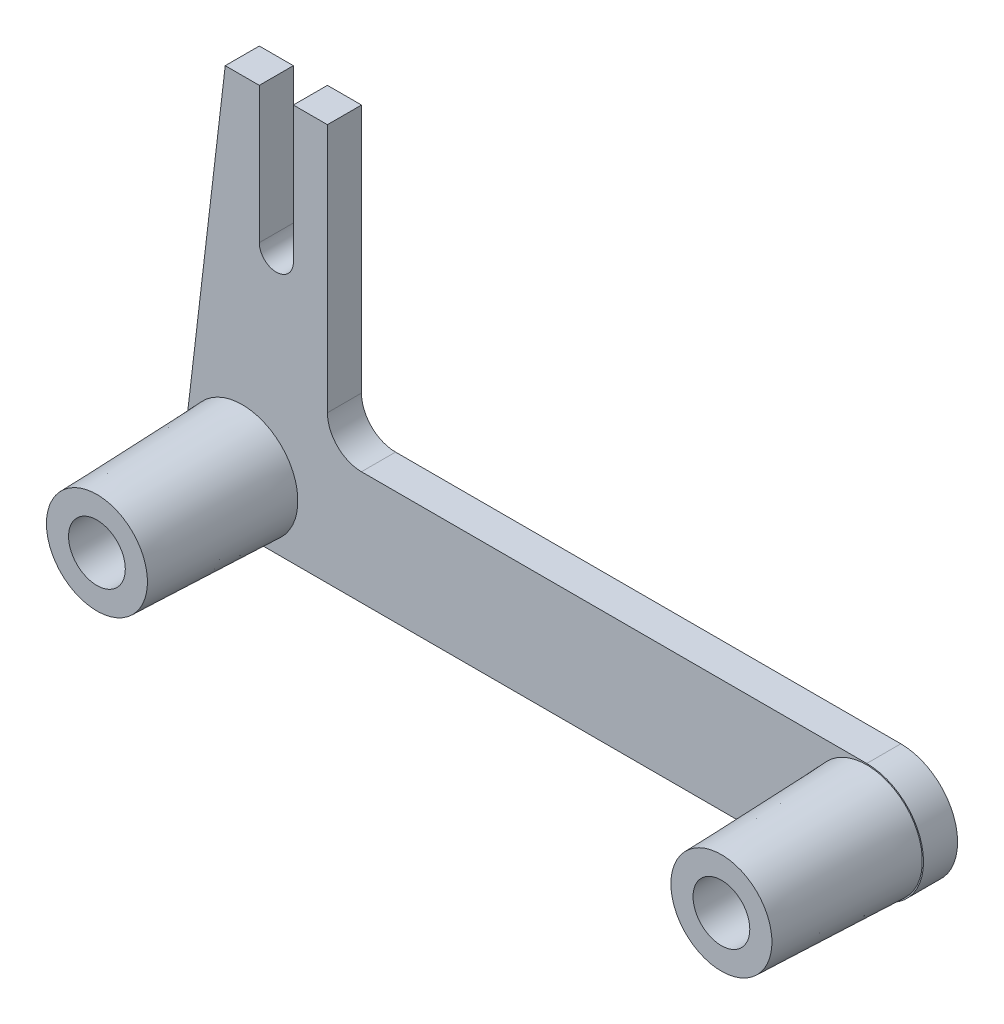
ISO-10303-21;
HEADER;
FILE_DESCRIPTION(('STEP AP214'),'2;1');
FILE_NAME('part.step','',(''),(''),'','','');
FILE_SCHEMA(('AUTOMOTIVE_DESIGN { 1 0 10303 214 1 1 1 1 }'));
ENDSEC;
DATA;
#1=APPLICATION_CONTEXT('core data for automotive mechanical design processes');
#2=APPLICATION_PROTOCOL_DEFINITION('international standard','automotive_design',2000,#1);
#3=PRODUCT_CONTEXT('',#1,'mechanical');
#4=PRODUCT('Part','Part','',(#3));
#5=PRODUCT_RELATED_PRODUCT_CATEGORY('part','',(#4));
#6=PRODUCT_DEFINITION_FORMATION('','',#4);
#7=PRODUCT_DEFINITION_CONTEXT('part definition',#1,'design');
#8=PRODUCT_DEFINITION('design','',#6,#7);
#9=PRODUCT_DEFINITION_SHAPE('','',#8);
#10=(LENGTH_UNIT() NAMED_UNIT(*) SI_UNIT(.MILLI.,.METRE.));
#11=(NAMED_UNIT(*) PLANE_ANGLE_UNIT() SI_UNIT($,.RADIAN.));
#12=(NAMED_UNIT(*) SI_UNIT($,.STERADIAN.) SOLID_ANGLE_UNIT());
#13=UNCERTAINTY_MEASURE_WITH_UNIT(LENGTH_MEASURE(1.E-05),#10,'distance_accuracy_value','');
#14=(GEOMETRIC_REPRESENTATION_CONTEXT(3) GLOBAL_UNCERTAINTY_ASSIGNED_CONTEXT((#13)) GLOBAL_UNIT_ASSIGNED_CONTEXT((#10,
#11,#12)) REPRESENTATION_CONTEXT('',''));
#15=CARTESIAN_POINT('',(0.,0.,0.));
#16=DIRECTION('',(0.,0.,1.));
#17=DIRECTION('',(1.,0.,0.));
#18=AXIS2_PLACEMENT_3D('',#15,#16,#17);
#19=CARTESIAN_POINT('',(0.149951438834714,1.85557583058385,15.8));
#20=DIRECTION('',(0.,0.,-1.));
#21=DIRECTION('',(-1.,0.,0.));
#22=AXIS2_PLACEMENT_3D('',#19,#20,#21);
#23=PLANE('',#22);
#24=CARTESIAN_POINT('',(0.149951438834714,1.85557583058385,15.8));
#25=DIRECTION('',(0.,0.,-1.));
#26=DIRECTION('',(-1.,0.,0.));
#27=AXIS2_PLACEMENT_3D('',#24,#25,#26);
#28=CIRCLE('',#27,4.44825184203038);
#29=CARTESIAN_POINT('',(-4.29830040319567,1.85557583058385,15.8));
#30=VERTEX_POINT('',#29);
#31=EDGE_CURVE('E141',#30,#30,#28,.T.);
#32=ORIENTED_EDGE('',*,*,#31,.F.);
#33=EDGE_LOOP('',(#32));
#34=FACE_BOUND('',#33,.T.);
#35=CARTESIAN_POINT('',(0.149951438834714,1.85557583058385,15.8));
#36=DIRECTION('',(0.,0.,1.));
#37=DIRECTION('',(1.,0.,0.));
#38=AXIS2_PLACEMENT_3D('',#35,#36,#37);
#39=CIRCLE('',#38,2.5);
#40=CARTESIAN_POINT('',(2.64995143883471,1.85557583058385,15.8));
#41=VERTEX_POINT('',#40);
#42=EDGE_CURVE('E308',#41,#41,#39,.T.);
#43=ORIENTED_EDGE('',*,*,#42,.F.);
#44=EDGE_LOOP('',(#43));
#45=FACE_BOUND('',#44,.T.);
#46=ADVANCED_FACE('F30',(#34,#45),#23,.F.);
#47=CARTESIAN_POINT('',(10.6499514388347,9.88362192636454,0.));
#48=DIRECTION('',(0.,0.,-1.));
#49=DIRECTION('',(-1.,0.,0.));
#50=AXIS2_PLACEMENT_3D('',#47,#48,#49);
#51=PLANE('',#50);
#52=CARTESIAN_POINT('',(55.1499514388347,1.88362192636452,0.));
#53=DIRECTION('',(0.,0.,1.));
#54=DIRECTION('',(1.,0.,0.));
#55=AXIS2_PLACEMENT_3D('',#52,#53,#54);
#56=CIRCLE('',#55,2.5);
#57=CARTESIAN_POINT('',(57.6499514388347,1.88362192636452,0.));
#58=VERTEX_POINT('',#57);
#59=EDGE_CURVE('E299',#58,#58,#56,.T.);
#60=ORIENTED_EDGE('',*,*,#59,.T.);
#61=EDGE_LOOP('',(#60));
#62=FACE_BOUND('',#61,.T.);
#63=DIRECTION('',(-1.,0.,0.));
#64=VECTOR('',#63,1.);
#65=CARTESIAN_POINT('',(55.1499514388347,6.88362192636452,0.));
#66=LINE('',#65,#64);
#67=CARTESIAN_POINT('',(55.1499514388347,6.88362192636452,0.));
#68=VERTEX_POINT('',#67);
#69=CARTESIAN_POINT('',(10.6499514388347,6.88362192636454,0.));
#70=VERTEX_POINT('',#69);
#71=EDGE_CURVE('E164',#68,#70,#66,.T.);
#72=ORIENTED_EDGE('',*,*,#71,.F.);
#73=CARTESIAN_POINT('',(55.1499514388347,1.88362192636452,0.));
#74=DIRECTION('',(0.,0.,1.));
#75=DIRECTION('',(1.,0.,0.));
#76=AXIS2_PLACEMENT_3D('',#73,#74,#75);
#77=CIRCLE('',#76,5.);
#78=CARTESIAN_POINT('',(55.1499514388347,-3.11637807363548,0.));
#79=VERTEX_POINT('',#78);
#80=EDGE_CURVE('E162',#79,#68,#77,.T.);
#81=ORIENTED_EDGE('',*,*,#80,.F.);
#82=DIRECTION('',(1.,0.,0.));
#83=VECTOR('',#82,1.);
#84=CARTESIAN_POINT('',(0.678793924191456,-3.11637807363546,0.));
#85=LINE('',#84,#83);
#86=CARTESIAN_POINT('',(0.678793924191456,-3.11637807363546,0.));
#87=VERTEX_POINT('',#86);
#88=EDGE_CURVE('E160',#87,#79,#85,.T.);
#89=ORIENTED_EDGE('',*,*,#88,.F.);
#90=CARTESIAN_POINT('',(0.149951438834714,1.85557583058385,0.));
#91=DIRECTION('',(0.,0.,1.));
#92=DIRECTION('',(1.,0.,0.));
#93=AXIS2_PLACEMENT_3D('',#90,#91,#92);
#94=CIRCLE('',#93,5.);
#95=CARTESIAN_POINT('',(-4.81570216702394,2.44062648362425,0.));
#96=VERTEX_POINT('',#95);
#97=EDGE_CURVE('E158',#96,#87,#94,.T.);
#98=ORIENTED_EDGE('',*,*,#97,.F.);
#99=DIRECTION('',(-0.11701013060808,-0.99313072117173,0.));
#100=VECTOR('',#99,1.);
#101=CARTESIAN_POINT('',(-1.35004856116529,31.8555758305839,0.));
#102=LINE('',#101,#100);
#103=CARTESIAN_POINT('',(-1.35004856116529,31.8555758305839,0.));
#104=VERTEX_POINT('',#103);
#105=EDGE_CURVE('E156',#104,#96,#102,.T.);
#106=ORIENTED_EDGE('',*,*,#105,.F.);
#107=DIRECTION('',(-1.,0.,0.));
#108=VECTOR('',#107,1.);
#109=CARTESIAN_POINT('',(1.64995143883472,31.8555758305838,0.));
#110=LINE('',#109,#108);
#111=CARTESIAN_POINT('',(1.64995143883472,31.8555758305838,0.));
#112=VERTEX_POINT('',#111);
#113=EDGE_CURVE('E154',#112,#104,#110,.T.);
#114=ORIENTED_EDGE('',*,*,#113,.F.);
#115=DIRECTION('',(0.,1.,0.));
#116=VECTOR('',#115,1.);
#117=CARTESIAN_POINT('',(1.64995143883472,19.8555758305839,0.));
#118=LINE('',#117,#116);
#119=CARTESIAN_POINT('',(1.64995143883472,19.8555758305839,0.));
#120=VERTEX_POINT('',#119);
#121=EDGE_CURVE('E152',#120,#112,#118,.T.);
#122=ORIENTED_EDGE('',*,*,#121,.F.);
#123=CARTESIAN_POINT('',(3.14995143883472,19.8555758305839,0.));
#124=DIRECTION('',(0.,0.,1.));
#125=DIRECTION('',(1.,0.,0.));
#126=AXIS2_PLACEMENT_3D('',#123,#124,#125);
#127=CIRCLE('',#126,1.5);
#128=CARTESIAN_POINT('',(4.64995143883472,19.8555758305839,0.));
#129=VERTEX_POINT('',#128);
#130=EDGE_CURVE('E149',#120,#129,#127,.T.);
#131=ORIENTED_EDGE('',*,*,#130,.T.);
#132=DIRECTION('',(0.,-1.,0.));
#133=VECTOR('',#132,1.);
#134=CARTESIAN_POINT('',(4.64995143883472,31.8555758305839,0.));
#135=LINE('',#134,#133);
#136=CARTESIAN_POINT('',(4.64995143883472,31.8555758305839,0.));
#137=VERTEX_POINT('',#136);
#138=EDGE_CURVE('E146',#137,#129,#135,.T.);
#139=ORIENTED_EDGE('',*,*,#138,.F.);
#140=DIRECTION('',(-1.,0.,0.));
#141=VECTOR('',#140,1.);
#142=CARTESIAN_POINT('',(7.64995143883471,31.8555758305839,0.));
#143=LINE('',#142,#141);
#144=CARTESIAN_POINT('',(7.64995143883471,31.8555758305839,0.));
#145=VERTEX_POINT('',#144);
#146=EDGE_CURVE('E126',#145,#137,#143,.T.);
#147=ORIENTED_EDGE('',*,*,#146,.F.);
#148=DIRECTION('',(0.,1.,0.));
#149=VECTOR('',#148,1.);
#150=CARTESIAN_POINT('',(7.64995143883471,9.88362192636454,0.));
#151=LINE('',#150,#149);
#152=CARTESIAN_POINT('',(7.64995143883471,9.88362192636454,0.));
#153=VERTEX_POINT('',#152);
#154=EDGE_CURVE('E119',#153,#145,#151,.T.);
#155=ORIENTED_EDGE('',*,*,#154,.F.);
#156=CARTESIAN_POINT('',(10.6499514388347,9.88362192636454,0.));
#157=DIRECTION('',(0.,0.,-1.));
#158=DIRECTION('',(-1.,0.,0.));
#159=AXIS2_PLACEMENT_3D('',#156,#157,#158);
#160=CIRCLE('',#159,3.);
#161=EDGE_CURVE('E124',#70,#153,#160,.T.);
#162=ORIENTED_EDGE('',*,*,#161,.F.);
#163=EDGE_LOOP('',(#72,#81,#89,#98,#106,#114,#122,#131,#139,#147,#155,#162));
#164=FACE_BOUND('',#163,.T.);
#165=CARTESIAN_POINT('',(0.149951438834714,1.85557583058385,0.));
#166=DIRECTION('',(0.,0.,1.));
#167=DIRECTION('',(1.,0.,0.));
#168=AXIS2_PLACEMENT_3D('',#165,#166,#167);
#169=CIRCLE('',#168,2.5);
#170=CARTESIAN_POINT('',(2.64995143883472,1.85557583058385,0.));
#171=VERTEX_POINT('',#170);
#172=EDGE_CURVE('E305',#171,#171,#169,.T.);
#173=ORIENTED_EDGE('',*,*,#172,.T.);
#174=EDGE_LOOP('',(#173));
#175=FACE_BOUND('',#174,.T.);
#176=ADVANCED_FACE('F121',(#62,#164,#175),#51,.T.);
#177=CARTESIAN_POINT('',(55.1499514388347,1.88362192636452,15.8));
#178=DIRECTION('',(0.,0.,-1.));
#179=DIRECTION('',(-1.,0.,0.));
#180=AXIS2_PLACEMENT_3D('',#177,#178,#179);
#181=PLANE('',#180);
#182=CARTESIAN_POINT('',(55.1499514388347,1.88362192636452,15.8));
#183=DIRECTION('',(0.,0.,-1.));
#184=DIRECTION('',(-1.,0.,0.));
#185=AXIS2_PLACEMENT_3D('',#182,#183,#184);
#186=CIRCLE('',#185,4.44825184203038);
#187=CARTESIAN_POINT('',(50.7016995968043,1.88362192636452,15.8));
#188=VERTEX_POINT('',#187);
#189=EDGE_CURVE('E294',#188,#188,#186,.T.);
#190=ORIENTED_EDGE('',*,*,#189,.F.);
#191=EDGE_LOOP('',(#190));
#192=FACE_BOUND('',#191,.T.);
#193=CARTESIAN_POINT('',(55.1499514388347,1.88362192636452,15.8));
#194=DIRECTION('',(0.,0.,1.));
#195=DIRECTION('',(1.,0.,0.));
#196=AXIS2_PLACEMENT_3D('',#193,#194,#195);
#197=CIRCLE('',#196,2.5);
#198=CARTESIAN_POINT('',(57.6499514388347,1.88362192636452,15.8));
#199=VERTEX_POINT('',#198);
#200=EDGE_CURVE('E302',#199,#199,#197,.T.);
#201=ORIENTED_EDGE('',*,*,#200,.F.);
#202=EDGE_LOOP('',(#201));
#203=FACE_BOUND('',#202,.T.);
#204=ADVANCED_FACE('F272',(#192,#203),#181,.F.);
#205=CARTESIAN_POINT('',(10.6499514388347,9.88362192636454,3.));
#206=DIRECTION('',(0.,0.,-1.));
#207=DIRECTION('',(-1.,0.,0.));
#208=AXIS2_PLACEMENT_3D('',#205,#206,#207);
#209=CYLINDRICAL_SURFACE('',#208,3.);
#210=ORIENTED_EDGE('',*,*,#161,.T.);
#211=DIRECTION('',(0.,0.,-1.));
#212=VECTOR('',#211,1.);
#213=CARTESIAN_POINT('',(7.64995143883471,9.88362192636454,3.));
#214=LINE('',#213,#212);
#215=CARTESIAN_POINT('',(7.64995143883471,9.88362192636454,3.));
#216=VERTEX_POINT('',#215);
#217=EDGE_CURVE('E11',#216,#153,#214,.T.);
#218=ORIENTED_EDGE('',*,*,#217,.F.);
#219=CARTESIAN_POINT('',(10.6499514388347,9.88362192636454,3.));
#220=DIRECTION('',(0.,0.,-1.));
#221=DIRECTION('',(-1.,0.,0.));
#222=AXIS2_PLACEMENT_3D('',#219,#220,#221);
#223=CIRCLE('',#222,3.);
#224=CARTESIAN_POINT('',(10.6499514388347,6.88362192636454,3.));
#225=VERTEX_POINT('',#224);
#226=EDGE_CURVE('E166',#225,#216,#223,.T.);
#227=ORIENTED_EDGE('',*,*,#226,.F.);
#228=DIRECTION('',(0.,0.,-1.));
#229=VECTOR('',#228,1.);
#230=CARTESIAN_POINT('',(10.6499514388347,6.88362192636454,3.));
#231=LINE('',#230,#229);
#232=EDGE_CURVE('E137',#225,#70,#231,.T.);
#233=ORIENTED_EDGE('',*,*,#232,.T.);
#234=EDGE_LOOP('',(#210,#218,#227,#233));
#235=FACE_BOUND('',#234,.T.);
#236=ADVANCED_FACE('F32',(#235),#209,.F.);
#237=CARTESIAN_POINT('',(7.64995143883471,9.88362192636454,3.));
#238=DIRECTION('',(-1.,0.,0.));
#239=DIRECTION('',(0.,-1.,0.));
#240=AXIS2_PLACEMENT_3D('',#237,#238,#239);
#241=PLANE('',#240);
#242=ORIENTED_EDGE('',*,*,#154,.T.);
#243=DIRECTION('',(0.,0.,-1.));
#244=VECTOR('',#243,1.);
#245=CARTESIAN_POINT('',(7.64995143883471,31.8555758305839,3.));
#246=LINE('',#245,#244);
#247=CARTESIAN_POINT('',(7.64995143883471,31.8555758305839,3.));
#248=VERTEX_POINT('',#247);
#249=EDGE_CURVE('E38',#248,#145,#246,.T.);
#250=ORIENTED_EDGE('',*,*,#249,.F.);
#251=DIRECTION('',(0.,1.,0.));
#252=VECTOR('',#251,1.);
#253=CARTESIAN_POINT('',(7.64995143883471,9.88362192636454,3.));
#254=LINE('',#253,#252);
#255=EDGE_CURVE('E133',#216,#248,#254,.T.);
#256=ORIENTED_EDGE('',*,*,#255,.F.);
#257=ORIENTED_EDGE('',*,*,#217,.T.);
#258=EDGE_LOOP('',(#242,#250,#256,#257));
#259=FACE_BOUND('',#258,.T.);
#260=ADVANCED_FACE('F132',(#259),#241,.F.);
#261=CARTESIAN_POINT('',(7.64995143883471,31.8555758305839,3.));
#262=DIRECTION('',(0.,-1.,0.));
#263=DIRECTION('',(0.,0.,-1.));
#264=AXIS2_PLACEMENT_3D('',#261,#262,#263);
#265=PLANE('',#264);
#266=ORIENTED_EDGE('',*,*,#146,.T.);
#267=DIRECTION('',(0.,0.,-1.));
#268=VECTOR('',#267,1.);
#269=CARTESIAN_POINT('',(4.64995143883472,31.8555758305839,3.));
#270=LINE('',#269,#268);
#271=CARTESIAN_POINT('',(4.64995143883472,31.8555758305839,3.));
#272=VERTEX_POINT('',#271);
#273=EDGE_CURVE('E211',#272,#137,#270,.T.);
#274=ORIENTED_EDGE('',*,*,#273,.F.);
#275=DIRECTION('',(-1.,0.,0.));
#276=VECTOR('',#275,1.);
#277=CARTESIAN_POINT('',(7.64995143883471,31.8555758305839,3.));
#278=LINE('',#277,#276);
#279=EDGE_CURVE('E169',#248,#272,#278,.T.);
#280=ORIENTED_EDGE('',*,*,#279,.F.);
#281=ORIENTED_EDGE('',*,*,#249,.T.);
#282=EDGE_LOOP('',(#266,#274,#280,#281));
#283=FACE_BOUND('',#282,.T.);
#284=ADVANCED_FACE('F215',(#283),#265,.F.);
#285=CARTESIAN_POINT('',(4.64995143883472,31.8555758305839,3.));
#286=DIRECTION('',(1.,0.,0.));
#287=DIRECTION('',(0.,1.,0.));
#288=AXIS2_PLACEMENT_3D('',#285,#286,#287);
#289=PLANE('',#288);
#290=ORIENTED_EDGE('',*,*,#138,.T.);
#291=DIRECTION('',(0.,0.,-1.));
#292=VECTOR('',#291,1.);
#293=CARTESIAN_POINT('',(4.64995143883472,19.8555758305839,3.));
#294=LINE('',#293,#292);
#295=CARTESIAN_POINT('',(4.64995143883472,19.8555758305839,3.));
#296=VERTEX_POINT('',#295);
#297=EDGE_CURVE('E209',#296,#129,#294,.T.);
#298=ORIENTED_EDGE('',*,*,#297,.F.);
#299=DIRECTION('',(0.,-1.,0.));
#300=VECTOR('',#299,1.);
#301=CARTESIAN_POINT('',(4.64995143883472,31.8555758305839,3.));
#302=LINE('',#301,#300);
#303=EDGE_CURVE('E171',#272,#296,#302,.T.);
#304=ORIENTED_EDGE('',*,*,#303,.F.);
#305=ORIENTED_EDGE('',*,*,#273,.T.);
#306=EDGE_LOOP('',(#290,#298,#304,#305));
#307=FACE_BOUND('',#306,.T.);
#308=ADVANCED_FACE('F222',(#307),#289,.F.);
#309=CARTESIAN_POINT('',(3.14995143883472,19.8555758305839,3.));
#310=DIRECTION('',(0.,0.,-1.));
#311=DIRECTION('',(-1.,0.,0.));
#312=AXIS2_PLACEMENT_3D('',#309,#310,#311);
#313=CYLINDRICAL_SURFACE('',#312,1.5);
#314=ORIENTED_EDGE('',*,*,#130,.F.);
#315=DIRECTION('',(0.,0.,-1.));
#316=VECTOR('',#315,1.);
#317=CARTESIAN_POINT('',(1.64995143883472,19.8555758305839,3.));
#318=LINE('',#317,#316);
#319=CARTESIAN_POINT('',(1.64995143883472,19.8555758305839,3.));
#320=VERTEX_POINT('',#319);
#321=EDGE_CURVE('E207',#320,#120,#318,.T.);
#322=ORIENTED_EDGE('',*,*,#321,.F.);
#323=CARTESIAN_POINT('',(3.14995143883472,19.8555758305839,3.));
#324=DIRECTION('',(0.,0.,1.));
#325=DIRECTION('',(1.,0.,0.));
#326=AXIS2_PLACEMENT_3D('',#323,#324,#325);
#327=CIRCLE('',#326,1.5);
#328=EDGE_CURVE('E173',#320,#296,#327,.T.);
#329=ORIENTED_EDGE('',*,*,#328,.T.);
#330=ORIENTED_EDGE('',*,*,#297,.T.);
#331=EDGE_LOOP('',(#314,#322,#329,#330));
#332=FACE_BOUND('',#331,.T.);
#333=ADVANCED_FACE('F225',(#332),#313,.F.);
#334=CARTESIAN_POINT('',(1.64995143883472,19.8555758305839,3.));
#335=DIRECTION('',(-1.,0.,0.));
#336=DIRECTION('',(0.,-1.,0.));
#337=AXIS2_PLACEMENT_3D('',#334,#335,#336);
#338=PLANE('',#337);
#339=ORIENTED_EDGE('',*,*,#121,.T.);
#340=DIRECTION('',(0.,0.,-1.));
#341=VECTOR('',#340,1.);
#342=CARTESIAN_POINT('',(1.64995143883472,31.8555758305838,3.));
#343=LINE('',#342,#341);
#344=CARTESIAN_POINT('',(1.64995143883472,31.8555758305838,3.));
#345=VERTEX_POINT('',#344);
#346=EDGE_CURVE('E204',#345,#112,#343,.T.);
#347=ORIENTED_EDGE('',*,*,#346,.F.);
#348=DIRECTION('',(0.,1.,0.));
#349=VECTOR('',#348,1.);
#350=CARTESIAN_POINT('',(1.64995143883472,19.8555758305839,3.));
#351=LINE('',#350,#349);
#352=EDGE_CURVE('E176',#320,#345,#351,.T.);
#353=ORIENTED_EDGE('',*,*,#352,.F.);
#354=ORIENTED_EDGE('',*,*,#321,.T.);
#355=EDGE_LOOP('',(#339,#347,#353,#354));
#356=FACE_BOUND('',#355,.T.);
#357=ADVANCED_FACE('F230',(#356),#338,.F.);
#358=CARTESIAN_POINT('',(1.64995143883472,31.8555758305838,3.));
#359=DIRECTION('',(0.,-1.,0.));
#360=DIRECTION('',(1.,0.,0.));
#361=AXIS2_PLACEMENT_3D('',#358,#359,#360);
#362=PLANE('',#361);
#363=ORIENTED_EDGE('',*,*,#113,.T.);
#364=DIRECTION('',(0.,0.,-1.));
#365=VECTOR('',#364,1.);
#366=CARTESIAN_POINT('',(-1.35004856116529,31.8555758305839,3.));
#367=LINE('',#366,#365);
#368=CARTESIAN_POINT('',(-1.35004856116529,31.8555758305839,3.));
#369=VERTEX_POINT('',#368);
#370=EDGE_CURVE('E201',#369,#104,#367,.T.);
#371=ORIENTED_EDGE('',*,*,#370,.F.);
#372=DIRECTION('',(-1.,0.,0.));
#373=VECTOR('',#372,1.);
#374=CARTESIAN_POINT('',(1.64995143883472,31.8555758305838,3.));
#375=LINE('',#374,#373);
#376=EDGE_CURVE('E178',#345,#369,#375,.T.);
#377=ORIENTED_EDGE('',*,*,#376,.F.);
#378=ORIENTED_EDGE('',*,*,#346,.T.);
#379=EDGE_LOOP('',(#363,#371,#377,#378));
#380=FACE_BOUND('',#379,.T.);
#381=ADVANCED_FACE('F236',(#380),#362,.F.);
#382=CARTESIAN_POINT('',(-1.35004856116529,31.8555758305839,3.));
#383=DIRECTION('',(0.99313072117173,-0.11701013060808,0.));
#384=DIRECTION('',(0.11701013060808,0.99313072117173,0.));
#385=AXIS2_PLACEMENT_3D('',#382,#383,#384);
#386=PLANE('',#385);
#387=ORIENTED_EDGE('',*,*,#105,.T.);
#388=DIRECTION('',(0.,0.,-1.));
#389=VECTOR('',#388,1.);
#390=CARTESIAN_POINT('',(-4.81570216702394,2.44062648362425,3.));
#391=LINE('',#390,#389);
#392=CARTESIAN_POINT('',(-4.81570216702394,2.44062648362425,3.));
#393=VERTEX_POINT('',#392);
#394=EDGE_CURVE('E198',#393,#96,#391,.T.);
#395=ORIENTED_EDGE('',*,*,#394,.F.);
#396=DIRECTION('',(-0.11701013060808,-0.99313072117173,0.));
#397=VECTOR('',#396,1.);
#398=CARTESIAN_POINT('',(-1.35004856116529,31.8555758305839,3.));
#399=LINE('',#398,#397);
#400=EDGE_CURVE('E180',#369,#393,#399,.T.);
#401=ORIENTED_EDGE('',*,*,#400,.F.);
#402=ORIENTED_EDGE('',*,*,#370,.T.);
#403=EDGE_LOOP('',(#387,#395,#401,#402));
#404=FACE_BOUND('',#403,.T.);
#405=ADVANCED_FACE('F240',(#404),#386,.F.);
#406=CARTESIAN_POINT('',(0.149951438834714,1.85557583058385,3.));
#407=DIRECTION('',(0.,0.,-1.));
#408=DIRECTION('',(-1.,0.,0.));
#409=AXIS2_PLACEMENT_3D('',#406,#407,#408);
#410=CYLINDRICAL_SURFACE('',#409,5.);
#411=ORIENTED_EDGE('',*,*,#97,.T.);
#412=DIRECTION('',(0.,0.,-1.));
#413=VECTOR('',#412,1.);
#414=CARTESIAN_POINT('',(0.678793924191456,-3.11637807363546,3.));
#415=LINE('',#414,#413);
#416=CARTESIAN_POINT('',(0.678793924191456,-3.11637807363546,3.));
#417=VERTEX_POINT('',#416);
#418=EDGE_CURVE('E195',#417,#87,#415,.T.);
#419=ORIENTED_EDGE('',*,*,#418,.F.);
#420=CARTESIAN_POINT('',(0.149951438834714,1.85557583058385,3.));
#421=DIRECTION('',(0.,0.,1.));
#422=DIRECTION('',(1.,0.,0.));
#423=AXIS2_PLACEMENT_3D('',#420,#421,#422);
#424=CIRCLE('',#423,5.);
#425=EDGE_CURVE('E182',#393,#417,#424,.T.);
#426=ORIENTED_EDGE('',*,*,#425,.F.);
#427=ORIENTED_EDGE('',*,*,#394,.T.);
#428=EDGE_LOOP('',(#411,#419,#426,#427));
#429=FACE_BOUND('',#428,.T.);
#430=ADVANCED_FACE('F245',(#429),#410,.T.);
#431=CARTESIAN_POINT('',(0.678793924191456,-3.11637807363546,3.));
#432=DIRECTION('',(0.,1.,0.));
#433=DIRECTION('',(-1.,0.,0.));
#434=AXIS2_PLACEMENT_3D('',#431,#432,#433);
#435=PLANE('',#434);
#436=ORIENTED_EDGE('',*,*,#88,.T.);
#437=DIRECTION('',(0.,0.,-1.));
#438=VECTOR('',#437,1.);
#439=CARTESIAN_POINT('',(55.1499514388347,-3.11637807363548,3.));
#440=LINE('',#439,#438);
#441=CARTESIAN_POINT('',(55.1499514388347,-3.11637807363548,3.));
#442=VERTEX_POINT('',#441);
#443=EDGE_CURVE('E192',#442,#79,#440,.T.);
#444=ORIENTED_EDGE('',*,*,#443,.F.);
#445=DIRECTION('',(1.,0.,0.));
#446=VECTOR('',#445,1.);
#447=CARTESIAN_POINT('',(0.678793924191456,-3.11637807363546,3.));
#448=LINE('',#447,#446);
#449=EDGE_CURVE('E184',#417,#442,#448,.T.);
#450=ORIENTED_EDGE('',*,*,#449,.F.);
#451=ORIENTED_EDGE('',*,*,#418,.T.);
#452=EDGE_LOOP('',(#436,#444,#450,#451));
#453=FACE_BOUND('',#452,.T.);
#454=ADVANCED_FACE('F249',(#453),#435,.F.);
#455=CARTESIAN_POINT('',(55.1499514388347,1.88362192636452,3.));
#456=DIRECTION('',(0.,0.,-1.));
#457=DIRECTION('',(-1.,0.,0.));
#458=AXIS2_PLACEMENT_3D('',#455,#456,#457);
#459=CYLINDRICAL_SURFACE('',#458,5.);
#460=ORIENTED_EDGE('',*,*,#80,.T.);
#461=DIRECTION('',(0.,0.,-1.));
#462=VECTOR('',#461,1.);
#463=CARTESIAN_POINT('',(55.1499514388347,6.88362192636452,3.));
#464=LINE('',#463,#462);
#465=CARTESIAN_POINT('',(55.1499514388347,6.88362192636452,3.));
#466=VERTEX_POINT('',#465);
#467=EDGE_CURVE('E189',#466,#68,#464,.T.);
#468=ORIENTED_EDGE('',*,*,#467,.F.);
#469=CARTESIAN_POINT('',(55.1499514388347,1.88362192636452,3.));
#470=DIRECTION('',(0.,0.,1.));
#471=DIRECTION('',(1.,0.,0.));
#472=AXIS2_PLACEMENT_3D('',#469,#470,#471);
#473=CIRCLE('',#472,5.);
#474=EDGE_CURVE('E50',#442,#466,#473,.T.);
#475=ORIENTED_EDGE('',*,*,#474,.F.);
#476=ORIENTED_EDGE('',*,*,#443,.T.);
#477=EDGE_LOOP('',(#460,#468,#475,#476));
#478=FACE_BOUND('',#477,.T.);
#479=ADVANCED_FACE('F253',(#478),#459,.T.);
#480=CARTESIAN_POINT('',(55.1499514388347,6.88362192636452,3.));
#481=DIRECTION('',(0.,-1.,0.));
#482=DIRECTION('',(1.,0.,0.));
#483=AXIS2_PLACEMENT_3D('',#480,#481,#482);
#484=PLANE('',#483);
#485=ORIENTED_EDGE('',*,*,#71,.T.);
#486=ORIENTED_EDGE('',*,*,#232,.F.);
#487=DIRECTION('',(-1.,0.,0.));
#488=VECTOR('',#487,1.);
#489=CARTESIAN_POINT('',(55.1499514388347,6.88362192636452,3.));
#490=LINE('',#489,#488);
#491=EDGE_CURVE('E45',#466,#225,#490,.T.);
#492=ORIENTED_EDGE('',*,*,#491,.F.);
#493=ORIENTED_EDGE('',*,*,#467,.T.);
#494=EDGE_LOOP('',(#485,#486,#492,#493));
#495=FACE_BOUND('',#494,.T.);
#496=ADVANCED_FACE('F255',(#495),#484,.F.);
#497=CARTESIAN_POINT('',(10.6499514388347,9.88362192636454,3.));
#498=DIRECTION('',(0.,0.,-1.));
#499=DIRECTION('',(-1.,0.,0.));
#500=AXIS2_PLACEMENT_3D('',#497,#498,#499);
#501=PLANE('',#500);
#502=CARTESIAN_POINT('',(55.1499514388347,1.88362192636452,3.));
#503=DIRECTION('',(0.,0.,-1.));
#504=DIRECTION('',(-1.,0.,0.));
#505=AXIS2_PLACEMENT_3D('',#502,#503,#504);
#506=CIRCLE('',#505,4.89523769152475);
#507=CARTESIAN_POINT('',(50.25471374731,1.88362192636452,3.));
#508=VERTEX_POINT('',#507);
#509=EDGE_CURVE('E292',#508,#508,#506,.T.);
#510=ORIENTED_EDGE('',*,*,#509,.T.);
#511=EDGE_LOOP('',(#510));
#512=FACE_BOUND('',#511,.T.);
#513=CARTESIAN_POINT('',(0.149951438834714,1.85557583058385,3.));
#514=DIRECTION('',(0.,0.,-1.));
#515=DIRECTION('',(-1.,0.,0.));
#516=AXIS2_PLACEMENT_3D('',#513,#514,#515);
#517=CIRCLE('',#516,4.89523769152476);
#518=CARTESIAN_POINT('',(-4.74528625269004,1.85557583058385,3.));
#519=VERTEX_POINT('',#518);
#520=EDGE_CURVE('E138',#519,#519,#517,.T.);
#521=ORIENTED_EDGE('',*,*,#520,.T.);
#522=EDGE_LOOP('',(#521));
#523=FACE_BOUND('',#522,.T.);
#524=ORIENTED_EDGE('',*,*,#226,.T.);
#525=ORIENTED_EDGE('',*,*,#255,.T.);
#526=ORIENTED_EDGE('',*,*,#279,.T.);
#527=ORIENTED_EDGE('',*,*,#303,.T.);
#528=ORIENTED_EDGE('',*,*,#328,.F.);
#529=ORIENTED_EDGE('',*,*,#352,.T.);
#530=ORIENTED_EDGE('',*,*,#376,.T.);
#531=ORIENTED_EDGE('',*,*,#400,.T.);
#532=ORIENTED_EDGE('',*,*,#425,.T.);
#533=ORIENTED_EDGE('',*,*,#449,.T.);
#534=ORIENTED_EDGE('',*,*,#474,.T.);
#535=ORIENTED_EDGE('',*,*,#491,.T.);
#536=EDGE_LOOP('',(#524,#525,#526,#527,#528,#529,#530,#531,#532,#533,#534,#535));
#537=FACE_BOUND('',#536,.T.);
#538=ADVANCED_FACE('F218',(#512,#523,#537),#501,.F.);
#539=CARTESIAN_POINT('',(0.149951438834714,1.85557583058385,0.));
#540=DIRECTION('',(0.,0.,-1.));
#541=DIRECTION('',(-1.,0.,0.));
#542=AXIS2_PLACEMENT_3D('',#539,#540,#541);
#543=CONICAL_SURFACE('',#542,5.,0.0349065850398867);
#544=ORIENTED_EDGE('',*,*,#31,.T.);
#545=EDGE_LOOP('',(#544));
#546=FACE_BOUND('',#545,.T.);
#547=ORIENTED_EDGE('',*,*,#520,.F.);
#548=EDGE_LOOP('',(#547));
#549=FACE_BOUND('',#548,.T.);
#550=ADVANCED_FACE('F262',(#546,#549),#543,.T.);
#551=CARTESIAN_POINT('',(55.1499514388347,1.88362192636452,0.));
#552=DIRECTION('',(0.,0.,-1.));
#553=DIRECTION('',(-1.,0.,0.));
#554=AXIS2_PLACEMENT_3D('',#551,#552,#553);
#555=CONICAL_SURFACE('',#554,5.,0.0349065850398867);
#556=ORIENTED_EDGE('',*,*,#189,.T.);
#557=EDGE_LOOP('',(#556));
#558=FACE_BOUND('',#557,.T.);
#559=ORIENTED_EDGE('',*,*,#509,.F.);
#560=EDGE_LOOP('',(#559));
#561=FACE_BOUND('',#560,.T.);
#562=ADVANCED_FACE('F279',(#558,#561),#555,.T.);
#563=CARTESIAN_POINT('',(55.1499514388347,1.88362192636452,15.8));
#564=DIRECTION('',(0.,0.,1.));
#565=DIRECTION('',(1.,0.,0.));
#566=AXIS2_PLACEMENT_3D('',#563,#564,#565);
#567=CYLINDRICAL_SURFACE('',#566,2.5);
#568=ORIENTED_EDGE('',*,*,#200,.T.);
#569=EDGE_LOOP('',(#568));
#570=FACE_BOUND('',#569,.T.);
#571=ORIENTED_EDGE('',*,*,#59,.F.);
#572=EDGE_LOOP('',(#571));
#573=FACE_BOUND('',#572,.T.);
#574=ADVANCED_FACE('F286',(#570,#573),#567,.F.);
#575=CARTESIAN_POINT('',(0.149951438834714,1.85557583058385,15.8));
#576=DIRECTION('',(0.,0.,1.));
#577=DIRECTION('',(1.,0.,0.));
#578=AXIS2_PLACEMENT_3D('',#575,#576,#577);
#579=CYLINDRICAL_SURFACE('',#578,2.5);
#580=ORIENTED_EDGE('',*,*,#42,.T.);
#581=EDGE_LOOP('',(#580));
#582=FACE_BOUND('',#581,.T.);
#583=ORIENTED_EDGE('',*,*,#172,.F.);
#584=EDGE_LOOP('',(#583));
#585=FACE_BOUND('',#584,.T.);
#586=ADVANCED_FACE('F312',(#582,#585),#579,.F.);
#587=CLOSED_SHELL('',(#46,#176,#204,#236,#260,#284,#308,#333,#357,#381,#405,#430,#454,#479,#496,
#538,#550,#562,#574,#586));
#588=MANIFOLD_SOLID_BREP('B2',#587);
#589=ADVANCED_BREP_SHAPE_REPRESENTATION('',(#18,#588),#14);
#590=SHAPE_DEFINITION_REPRESENTATION(#9,#589);
ENDSEC;
END-ISO-10303-21;
